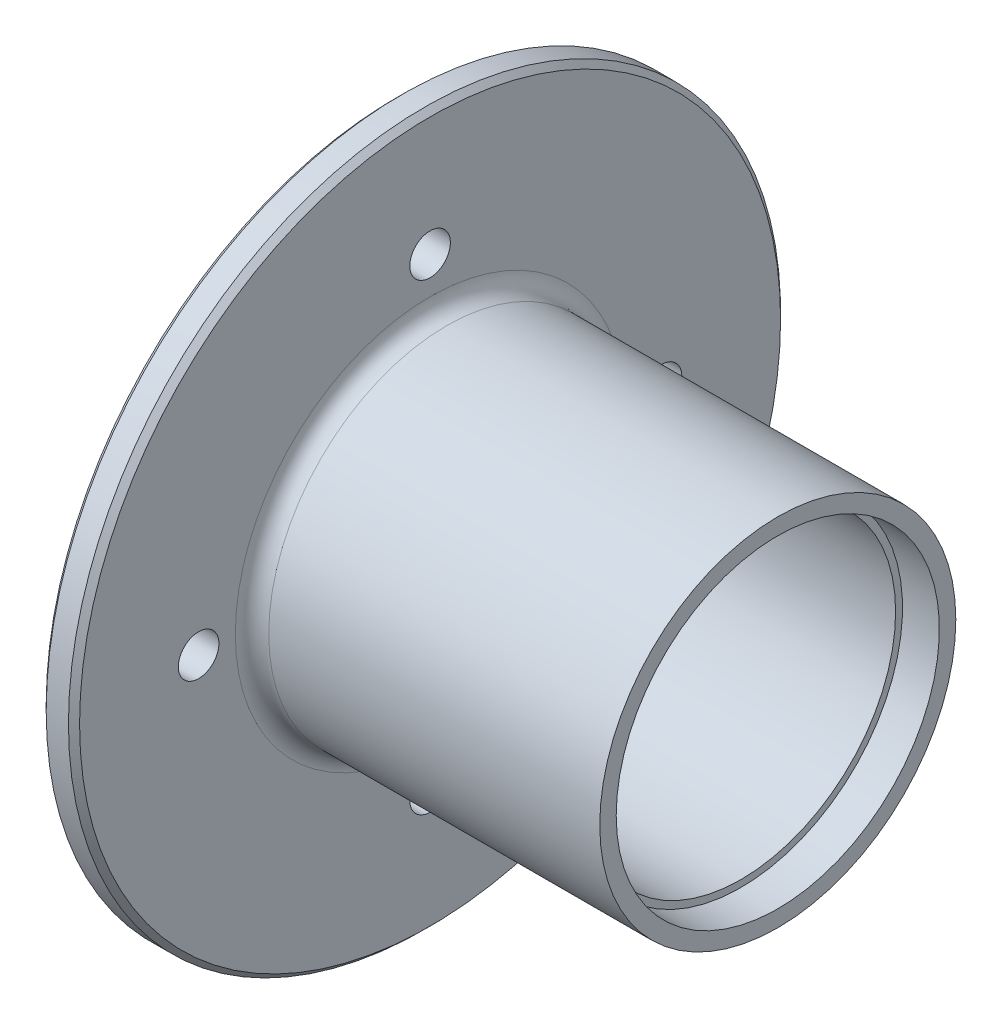
ISO-10303-21;
HEADER;
FILE_DESCRIPTION(('STEP AP214'),'2;1');
FILE_NAME('part.step','',(''),(''),'','','');
FILE_SCHEMA(('AUTOMOTIVE_DESIGN { 1 0 10303 214 1 1 1 1 }'));
ENDSEC;
DATA;
#1=APPLICATION_CONTEXT('core data for automotive mechanical design processes');
#2=APPLICATION_PROTOCOL_DEFINITION('international standard','automotive_design',2000,#1);
#3=PRODUCT_CONTEXT('',#1,'mechanical');
#4=PRODUCT('Part','Part','',(#3));
#5=PRODUCT_RELATED_PRODUCT_CATEGORY('part','',(#4));
#6=PRODUCT_DEFINITION_FORMATION('','',#4);
#7=PRODUCT_DEFINITION_CONTEXT('part definition',#1,'design');
#8=PRODUCT_DEFINITION('design','',#6,#7);
#9=PRODUCT_DEFINITION_SHAPE('','',#8);
#10=(LENGTH_UNIT() NAMED_UNIT(*) SI_UNIT(.MILLI.,.METRE.));
#11=(NAMED_UNIT(*) PLANE_ANGLE_UNIT() SI_UNIT($,.RADIAN.));
#12=(NAMED_UNIT(*) SI_UNIT($,.STERADIAN.) SOLID_ANGLE_UNIT());
#13=UNCERTAINTY_MEASURE_WITH_UNIT(LENGTH_MEASURE(1.E-05),#10,'distance_accuracy_value','');
#14=(GEOMETRIC_REPRESENTATION_CONTEXT(3) GLOBAL_UNCERTAINTY_ASSIGNED_CONTEXT((#13)) GLOBAL_UNIT_ASSIGNED_CONTEXT((#10,
#11,#12)) REPRESENTATION_CONTEXT('',''));
#15=CARTESIAN_POINT('',(0.,0.,0.));
#16=DIRECTION('',(0.,0.,1.));
#17=DIRECTION('',(1.,0.,0.));
#18=AXIS2_PLACEMENT_3D('',#15,#16,#17);
#19=CARTESIAN_POINT('',(10.4893383997967,0.,0.));
#20=DIRECTION('',(-1.,0.,0.));
#21=DIRECTION('',(0.,0.,1.));
#22=AXIS2_PLACEMENT_3D('',#19,#20,#21);
#23=TOROIDAL_SURFACE('',#22,27.78125,2.38125);
#24=CARTESIAN_POINT('',(10.4893383997967,0.,0.));
#25=DIRECTION('',(-1.,0.,0.));
#26=DIRECTION('',(0.,0.,1.));
#27=AXIS2_PLACEMENT_3D('',#24,#25,#26);
#28=CIRCLE('',#27,25.4);
#29=CARTESIAN_POINT('',(10.4893383997967,0.,25.4));
#30=VERTEX_POINT('',#29);
#31=EDGE_CURVE('E104',#30,#30,#28,.T.);
#32=ORIENTED_EDGE('',*,*,#31,.T.);
#33=EDGE_LOOP('',(#32));
#34=FACE_BOUND('',#33,.T.);
#35=CARTESIAN_POINT('',(8.10808839979671,0.,0.));
#36=DIRECTION('',(-1.,0.,0.));
#37=DIRECTION('',(0.,0.,1.));
#38=AXIS2_PLACEMENT_3D('',#35,#36,#37);
#39=CIRCLE('',#38,27.78125);
#40=CARTESIAN_POINT('',(8.10808839979671,0.,27.78125));
#41=VERTEX_POINT('',#40);
#42=EDGE_CURVE('E10',#41,#41,#39,.T.);
#43=ORIENTED_EDGE('',*,*,#42,.F.);
#44=EDGE_LOOP('',(#43));
#45=FACE_BOUND('',#44,.T.);
#46=ADVANCED_FACE('F41',(#34,#45),#23,.F.);
#47=CARTESIAN_POINT('',(8.10808839979671,0.,0.));
#48=DIRECTION('',(-1.,0.,0.));
#49=DIRECTION('',(0.,0.,1.));
#50=AXIS2_PLACEMENT_3D('',#47,#48,#49);
#51=PLANE('',#50);
#52=CARTESIAN_POINT('',(8.10808839979671,3.45866141425801E-13,33.02));
#53=DIRECTION('',(1.,0.,0.));
#54=DIRECTION('',(0.,0.,-1.));
#55=AXIS2_PLACEMENT_3D('',#52,#53,#54);
#56=CIRCLE('',#55,2.8956);
#57=CARTESIAN_POINT('',(8.10808839979671,3.45866141425801E-13,30.1244));
#58=VERTEX_POINT('',#57);
#59=EDGE_CURVE('E136',#58,#58,#56,.T.);
#60=ORIENTED_EDGE('',*,*,#59,.F.);
#61=EDGE_LOOP('',(#60));
#62=FACE_BOUND('',#61,.T.);
#63=CARTESIAN_POINT('',(8.10808839979671,-33.02,0.));
#64=DIRECTION('',(1.,0.,0.));
#65=DIRECTION('',(0.,0.,-1.));
#66=AXIS2_PLACEMENT_3D('',#63,#64,#65);
#67=CIRCLE('',#66,2.8956);
#68=CARTESIAN_POINT('',(8.10808839979671,-33.02,-2.8956));
#69=VERTEX_POINT('',#68);
#70=EDGE_CURVE('E128',#69,#69,#67,.T.);
#71=ORIENTED_EDGE('',*,*,#70,.F.);
#72=EDGE_LOOP('',(#71));
#73=FACE_BOUND('',#72,.T.);
#74=CARTESIAN_POINT('',(8.10808839979671,-1.152887138086E-13,-33.02));
#75=DIRECTION('',(1.,0.,0.));
#76=DIRECTION('',(0.,0.,-1.));
#77=AXIS2_PLACEMENT_3D('',#74,#75,#76);
#78=CIRCLE('',#77,2.8956);
#79=CARTESIAN_POINT('',(8.10808839979671,-1.152887138086E-13,-35.9156));
#80=VERTEX_POINT('',#79);
#81=EDGE_CURVE('E120',#80,#80,#78,.T.);
#82=ORIENTED_EDGE('',*,*,#81,.F.);
#83=EDGE_LOOP('',(#82));
#84=FACE_BOUND('',#83,.T.);
#85=CARTESIAN_POINT('',(8.10808839979671,33.02,0.));
#86=DIRECTION('',(1.,0.,0.));
#87=DIRECTION('',(0.,0.,-1.));
#88=AXIS2_PLACEMENT_3D('',#85,#86,#87);
#89=CIRCLE('',#88,2.8956);
#90=CARTESIAN_POINT('',(8.10808839979671,33.02,-2.8956));
#91=VERTEX_POINT('',#90);
#92=EDGE_CURVE('E112',#91,#91,#89,.T.);
#93=ORIENTED_EDGE('',*,*,#92,.F.);
#94=EDGE_LOOP('',(#93));
#95=FACE_BOUND('',#94,.T.);
#96=CARTESIAN_POINT('',(8.10808839979671,0.,0.));
#97=DIRECTION('',(-1.,0.,0.));
#98=DIRECTION('',(0.,0.,1.));
#99=AXIS2_PLACEMENT_3D('',#96,#97,#98);
#100=CIRCLE('',#99,50.00625);
#101=CARTESIAN_POINT('',(8.10808839979671,0.,50.00625));
#102=VERTEX_POINT('',#101);
#103=EDGE_CURVE('E48',#102,#102,#100,.T.);
#104=ORIENTED_EDGE('',*,*,#103,.F.);
#105=EDGE_LOOP('',(#104));
#106=FACE_BOUND('',#105,.T.);
#107=ORIENTED_EDGE('',*,*,#42,.T.);
#108=EDGE_LOOP('',(#107));
#109=FACE_BOUND('',#108,.T.);
#110=ADVANCED_FACE('F143',(#62,#73,#84,#95,#106,#109),#51,.F.);
#111=CARTESIAN_POINT('',(8.10808839979671,0.,0.));
#112=DIRECTION('',(-1.,0.,0.));
#113=DIRECTION('',(0.,0.,1.));
#114=AXIS2_PLACEMENT_3D('',#111,#112,#113);
#115=CONICAL_SURFACE('',#114,50.00625,0.785398163397448);
#116=CARTESIAN_POINT('',(7.3143383997967,0.,0.));
#117=DIRECTION('',(-1.,0.,0.));
#118=DIRECTION('',(0.,0.,1.));
#119=AXIS2_PLACEMENT_3D('',#116,#117,#118);
#120=CIRCLE('',#119,50.8);
#121=CARTESIAN_POINT('',(7.3143383997967,0.,50.8));
#122=VERTEX_POINT('',#121);
#123=EDGE_CURVE('E53',#122,#122,#120,.T.);
#124=ORIENTED_EDGE('',*,*,#123,.F.);
#125=EDGE_LOOP('',(#124));
#126=FACE_BOUND('',#125,.T.);
#127=ORIENTED_EDGE('',*,*,#103,.T.);
#128=EDGE_LOOP('',(#127));
#129=FACE_BOUND('',#128,.T.);
#130=ADVANCED_FACE('F146',(#126,#129),#115,.T.);
#131=CARTESIAN_POINT('',(0.,0.,0.));
#132=DIRECTION('',(-1.,0.,0.));
#133=DIRECTION('',(0.,0.,1.));
#134=AXIS2_PLACEMENT_3D('',#131,#132,#133);
#135=CYLINDRICAL_SURFACE('',#134,50.8);
#136=CARTESIAN_POINT('',(4.13933839979672,0.,0.));
#137=DIRECTION('',(-1.,0.,0.));
#138=DIRECTION('',(0.,0.,1.));
#139=AXIS2_PLACEMENT_3D('',#136,#137,#138);
#140=CIRCLE('',#139,50.8);
#141=CARTESIAN_POINT('',(4.13933839979672,0.,50.8));
#142=VERTEX_POINT('',#141);
#143=EDGE_CURVE('E58',#142,#142,#140,.T.);
#144=ORIENTED_EDGE('',*,*,#143,.F.);
#145=EDGE_LOOP('',(#144));
#146=FACE_BOUND('',#145,.T.);
#147=ORIENTED_EDGE('',*,*,#123,.T.);
#148=EDGE_LOOP('',(#147));
#149=FACE_BOUND('',#148,.T.);
#150=ADVANCED_FACE('F237',(#146,#149),#135,.T.);
#151=CARTESIAN_POINT('',(4.13933839979672,0.,0.));
#152=DIRECTION('',(1.,0.,0.));
#153=DIRECTION('',(0.,0.,-1.));
#154=AXIS2_PLACEMENT_3D('',#151,#152,#153);
#155=CONICAL_SURFACE('',#154,50.8,0.785398163397448);
#156=CARTESIAN_POINT('',(3.34558839979671,0.,0.));
#157=DIRECTION('',(-1.,0.,0.));
#158=DIRECTION('',(0.,0.,1.));
#159=AXIS2_PLACEMENT_3D('',#156,#157,#158);
#160=CIRCLE('',#159,50.0062499999999);
#161=CARTESIAN_POINT('',(3.34558839979671,0.,50.0062499999999));
#162=VERTEX_POINT('',#161);
#163=EDGE_CURVE('E64',#162,#162,#160,.T.);
#164=ORIENTED_EDGE('',*,*,#163,.F.);
#165=EDGE_LOOP('',(#164));
#166=FACE_BOUND('',#165,.T.);
#167=ORIENTED_EDGE('',*,*,#143,.T.);
#168=EDGE_LOOP('',(#167));
#169=FACE_BOUND('',#168,.T.);
#170=ADVANCED_FACE('F230',(#166,#169),#155,.T.);
#171=CARTESIAN_POINT('',(3.34558839979671,0.,0.));
#172=DIRECTION('',(1.,0.,0.));
#173=DIRECTION('',(0.,0.,-1.));
#174=AXIS2_PLACEMENT_3D('',#171,#172,#173);
#175=PLANE('',#174);
#176=CARTESIAN_POINT('',(3.34558839979671,3.45866141425801E-13,33.02));
#177=DIRECTION('',(1.,0.,0.));
#178=DIRECTION('',(0.,0.,-1.));
#179=AXIS2_PLACEMENT_3D('',#176,#177,#178);
#180=CIRCLE('',#179,2.8956);
#181=CARTESIAN_POINT('',(3.34558839979671,3.45866141425801E-13,30.1244));
#182=VERTEX_POINT('',#181);
#183=EDGE_CURVE('E132',#182,#182,#180,.T.);
#184=ORIENTED_EDGE('',*,*,#183,.T.);
#185=EDGE_LOOP('',(#184));
#186=FACE_BOUND('',#185,.T.);
#187=CARTESIAN_POINT('',(3.34558839979671,-33.02,0.));
#188=DIRECTION('',(1.,0.,0.));
#189=DIRECTION('',(0.,0.,-1.));
#190=AXIS2_PLACEMENT_3D('',#187,#188,#189);
#191=CIRCLE('',#190,2.8956);
#192=CARTESIAN_POINT('',(3.34558839979671,-33.02,-2.8956));
#193=VERTEX_POINT('',#192);
#194=EDGE_CURVE('E124',#193,#193,#191,.T.);
#195=ORIENTED_EDGE('',*,*,#194,.T.);
#196=EDGE_LOOP('',(#195));
#197=FACE_BOUND('',#196,.T.);
#198=CARTESIAN_POINT('',(3.34558839979671,-1.152887138086E-13,-33.02));
#199=DIRECTION('',(1.,0.,0.));
#200=DIRECTION('',(0.,0.,-1.));
#201=AXIS2_PLACEMENT_3D('',#198,#199,#200);
#202=CIRCLE('',#201,2.8956);
#203=CARTESIAN_POINT('',(3.34558839979671,-1.152887138086E-13,-35.9156));
#204=VERTEX_POINT('',#203);
#205=EDGE_CURVE('E116',#204,#204,#202,.T.);
#206=ORIENTED_EDGE('',*,*,#205,.T.);
#207=EDGE_LOOP('',(#206));
#208=FACE_BOUND('',#207,.T.);
#209=CARTESIAN_POINT('',(3.34558839979671,33.02,0.));
#210=DIRECTION('',(1.,0.,0.));
#211=DIRECTION('',(0.,0.,-1.));
#212=AXIS2_PLACEMENT_3D('',#209,#210,#211);
#213=CIRCLE('',#212,2.8956);
#214=CARTESIAN_POINT('',(3.34558839979671,33.02,-2.8956));
#215=VERTEX_POINT('',#214);
#216=EDGE_CURVE('E108',#215,#215,#213,.T.);
#217=ORIENTED_EDGE('',*,*,#216,.T.);
#218=EDGE_LOOP('',(#217));
#219=FACE_BOUND('',#218,.T.);
#220=CARTESIAN_POINT('',(3.34558839979671,0.,0.));
#221=DIRECTION('',(-1.,0.,0.));
#222=DIRECTION('',(0.,0.,1.));
#223=AXIS2_PLACEMENT_3D('',#220,#221,#222);
#224=CIRCLE('',#223,17.143351135521);
#225=CARTESIAN_POINT('',(3.34558839979671,0.,17.143351135521));
#226=VERTEX_POINT('',#225);
#227=EDGE_CURVE('E68',#226,#226,#224,.T.);
#228=ORIENTED_EDGE('',*,*,#227,.F.);
#229=EDGE_LOOP('',(#228));
#230=FACE_BOUND('',#229,.T.);
#231=ORIENTED_EDGE('',*,*,#163,.T.);
#232=EDGE_LOOP('',(#231));
#233=FACE_BOUND('',#232,.T.);
#234=ADVANCED_FACE('F224',(#186,#197,#208,#219,#230,#233),#175,.F.);
#235=CARTESIAN_POINT('',(3.34558839979671,0.,0.));
#236=DIRECTION('',(-1.,0.,0.));
#237=DIRECTION('',(0.,0.,1.));
#238=AXIS2_PLACEMENT_3D('',#235,#236,#237);
#239=CONICAL_SURFACE('',#238,17.143351135521,0.767642261232655);
#240=CARTESIAN_POINT('',(8.10808839979671,0.,0.));
#241=DIRECTION('',(-1.,0.,0.));
#242=DIRECTION('',(0.,0.,1.));
#243=AXIS2_PLACEMENT_3D('',#240,#241,#242);
#244=CIRCLE('',#243,12.5470426882416);
#245=CARTESIAN_POINT('',(8.10808839979671,0.,12.5470426882416));
#246=VERTEX_POINT('',#245);
#247=EDGE_CURVE('E72',#246,#246,#244,.T.);
#248=ORIENTED_EDGE('',*,*,#247,.F.);
#249=EDGE_LOOP('',(#248));
#250=FACE_BOUND('',#249,.T.);
#251=ORIENTED_EDGE('',*,*,#227,.T.);
#252=EDGE_LOOP('',(#251));
#253=FACE_BOUND('',#252,.T.);
#254=ADVANCED_FACE('F218',(#250,#253),#239,.F.);
#255=CARTESIAN_POINT('',(8.10808839979671,0.,0.));
#256=DIRECTION('',(-1.,0.,0.));
#257=DIRECTION('',(0.,0.,1.));
#258=AXIS2_PLACEMENT_3D('',#255,#256,#257);
#259=PLANE('',#258);
#260=CARTESIAN_POINT('',(8.10808839979671,0.,0.));
#261=DIRECTION('',(-1.,0.,0.));
#262=DIRECTION('',(0.,0.,1.));
#263=AXIS2_PLACEMENT_3D('',#260,#261,#262);
#264=CIRCLE('',#263,17.143351135521);
#265=CARTESIAN_POINT('',(8.10808839979671,0.,17.143351135521));
#266=VERTEX_POINT('',#265);
#267=EDGE_CURVE('E76',#266,#266,#264,.T.);
#268=ORIENTED_EDGE('',*,*,#267,.F.);
#269=EDGE_LOOP('',(#268));
#270=FACE_BOUND('',#269,.T.);
#271=ORIENTED_EDGE('',*,*,#247,.T.);
#272=EDGE_LOOP('',(#271));
#273=FACE_BOUND('',#272,.T.);
#274=ADVANCED_FACE('F212',(#270,#273),#259,.F.);
#275=CARTESIAN_POINT('',(0.,0.,0.));
#276=DIRECTION('',(-1.,0.,0.));
#277=DIRECTION('',(0.,0.,1.));
#278=AXIS2_PLACEMENT_3D('',#275,#276,#277);
#279=CYLINDRICAL_SURFACE('',#278,17.143351135521);
#280=CARTESIAN_POINT('',(23.5484240499049,0.,0.));
#281=DIRECTION('',(-1.,0.,0.));
#282=DIRECTION('',(0.,0.,1.));
#283=AXIS2_PLACEMENT_3D('',#280,#281,#282);
#284=CIRCLE('',#283,17.143351135521);
#285=CARTESIAN_POINT('',(23.5484240499049,0.,17.143351135521));
#286=VERTEX_POINT('',#285);
#287=EDGE_CURVE('E80',#286,#286,#284,.T.);
#288=ORIENTED_EDGE('',*,*,#287,.F.);
#289=EDGE_LOOP('',(#288));
#290=FACE_BOUND('',#289,.T.);
#291=ORIENTED_EDGE('',*,*,#267,.T.);
#292=EDGE_LOOP('',(#291));
#293=FACE_BOUND('',#292,.T.);
#294=ADVANCED_FACE('F206',(#290,#293),#279,.F.);
#295=CARTESIAN_POINT('',(23.5484240499049,0.,0.));
#296=DIRECTION('',(-1.,0.,0.));
#297=DIRECTION('',(0.,0.,1.));
#298=AXIS2_PLACEMENT_3D('',#295,#296,#297);
#299=PLANE('',#298);
#300=CARTESIAN_POINT('',(23.5484240499049,0.,0.));
#301=DIRECTION('',(-1.,0.,0.));
#302=DIRECTION('',(0.,0.,1.));
#303=AXIS2_PLACEMENT_3D('',#300,#301,#302);
#304=CIRCLE('',#303,22.067968077904);
#305=CARTESIAN_POINT('',(23.5484240499049,0.,22.067968077904));
#306=VERTEX_POINT('',#305);
#307=EDGE_CURVE('E84',#306,#306,#304,.T.);
#308=ORIENTED_EDGE('',*,*,#307,.F.);
#309=EDGE_LOOP('',(#308));
#310=FACE_BOUND('',#309,.T.);
#311=ORIENTED_EDGE('',*,*,#287,.T.);
#312=EDGE_LOOP('',(#311));
#313=FACE_BOUND('',#312,.T.);
#314=ADVANCED_FACE('F200',(#310,#313),#299,.F.);
#315=CARTESIAN_POINT('',(0.,0.,0.));
#316=DIRECTION('',(-1.,0.,0.));
#317=DIRECTION('',(0.,0.,1.));
#318=AXIS2_PLACEMENT_3D('',#315,#316,#317);
#319=CYLINDRICAL_SURFACE('',#318,22.067968077904);
#320=CARTESIAN_POINT('',(52.4579882922135,0.,0.));
#321=DIRECTION('',(-1.,0.,0.));
#322=DIRECTION('',(0.,0.,1.));
#323=AXIS2_PLACEMENT_3D('',#320,#321,#322);
#324=CIRCLE('',#323,22.067968077904);
#325=CARTESIAN_POINT('',(52.4579882922135,0.,22.067968077904));
#326=VERTEX_POINT('',#325);
#327=EDGE_CURVE('E88',#326,#326,#324,.T.);
#328=ORIENTED_EDGE('',*,*,#327,.F.);
#329=EDGE_LOOP('',(#328));
#330=FACE_BOUND('',#329,.T.);
#331=ORIENTED_EDGE('',*,*,#307,.T.);
#332=EDGE_LOOP('',(#331));
#333=FACE_BOUND('',#332,.T.);
#334=ADVANCED_FACE('F194',(#330,#333),#319,.F.);
#335=CARTESIAN_POINT('',(52.4579882922135,0.,0.));
#336=DIRECTION('',(-1.,0.,0.));
#337=DIRECTION('',(0.,0.,1.));
#338=AXIS2_PLACEMENT_3D('',#335,#336,#337);
#339=PLANE('',#338);
#340=CARTESIAN_POINT('',(52.4579882922135,0.,0.));
#341=DIRECTION('',(-1.,0.,0.));
#342=DIRECTION('',(0.,0.,1.));
#343=AXIS2_PLACEMENT_3D('',#340,#341,#342);
#344=CIRCLE('',#343,23.0528912698023);
#345=CARTESIAN_POINT('',(52.4579882922135,0.,23.0528912698023));
#346=VERTEX_POINT('',#345);
#347=EDGE_CURVE('E92',#346,#346,#344,.T.);
#348=ORIENTED_EDGE('',*,*,#347,.F.);
#349=EDGE_LOOP('',(#348));
#350=FACE_BOUND('',#349,.T.);
#351=ORIENTED_EDGE('',*,*,#327,.T.);
#352=EDGE_LOOP('',(#351));
#353=FACE_BOUND('',#352,.T.);
#354=ADVANCED_FACE('F188',(#350,#353),#339,.F.);
#355=CARTESIAN_POINT('',(0.,0.,0.));
#356=DIRECTION('',(-1.,0.,0.));
#357=DIRECTION('',(0.,0.,1.));
#358=AXIS2_PLACEMENT_3D('',#355,#356,#357);
#359=CYLINDRICAL_SURFACE('',#358,23.0528912698023);
#360=CARTESIAN_POINT('',(57.7142730811039,0.,0.));
#361=DIRECTION('',(-1.,0.,0.));
#362=DIRECTION('',(0.,0.,1.));
#363=AXIS2_PLACEMENT_3D('',#360,#361,#362);
#364=CIRCLE('',#363,23.0528912698023);
#365=CARTESIAN_POINT('',(57.7142730811039,0.,23.0528912698023));
#366=VERTEX_POINT('',#365);
#367=EDGE_CURVE('E96',#366,#366,#364,.T.);
#368=ORIENTED_EDGE('',*,*,#367,.F.);
#369=EDGE_LOOP('',(#368));
#370=FACE_BOUND('',#369,.T.);
#371=ORIENTED_EDGE('',*,*,#347,.T.);
#372=EDGE_LOOP('',(#371));
#373=FACE_BOUND('',#372,.T.);
#374=ADVANCED_FACE('F182',(#370,#373),#359,.F.);
#375=CARTESIAN_POINT('',(57.7142730811039,0.,0.));
#376=DIRECTION('',(-1.,0.,0.));
#377=DIRECTION('',(0.,0.,1.));
#378=AXIS2_PLACEMENT_3D('',#375,#376,#377);
#379=PLANE('',#378);
#380=CARTESIAN_POINT('',(57.7142730811039,0.,0.));
#381=DIRECTION('',(-1.,0.,0.));
#382=DIRECTION('',(0.,0.,1.));
#383=AXIS2_PLACEMENT_3D('',#380,#381,#382);
#384=CIRCLE('',#383,25.4);
#385=CARTESIAN_POINT('',(57.7142730811039,0.,25.4));
#386=VERTEX_POINT('',#385);
#387=EDGE_CURVE('E100',#386,#386,#384,.T.);
#388=ORIENTED_EDGE('',*,*,#387,.F.);
#389=EDGE_LOOP('',(#388));
#390=FACE_BOUND('',#389,.T.);
#391=ORIENTED_EDGE('',*,*,#367,.T.);
#392=EDGE_LOOP('',(#391));
#393=FACE_BOUND('',#392,.T.);
#394=ADVANCED_FACE('F167',(#390,#393),#379,.F.);
#395=CARTESIAN_POINT('',(0.,0.,0.));
#396=DIRECTION('',(-1.,0.,0.));
#397=DIRECTION('',(0.,0.,1.));
#398=AXIS2_PLACEMENT_3D('',#395,#396,#397);
#399=CYLINDRICAL_SURFACE('',#398,25.4);
#400=ORIENTED_EDGE('',*,*,#31,.F.);
#401=EDGE_LOOP('',(#400));
#402=FACE_BOUND('',#401,.T.);
#403=ORIENTED_EDGE('',*,*,#387,.T.);
#404=EDGE_LOOP('',(#403));
#405=FACE_BOUND('',#404,.T.);
#406=ADVANCED_FACE('F157',(#402,#405),#399,.T.);
#407=CARTESIAN_POINT('',(8.10808839979671,33.02,0.));
#408=DIRECTION('',(1.,0.,0.));
#409=DIRECTION('',(0.,0.,-1.));
#410=AXIS2_PLACEMENT_3D('',#407,#408,#409);
#411=CYLINDRICAL_SURFACE('',#410,2.8956);
#412=ORIENTED_EDGE('',*,*,#216,.F.);
#413=EDGE_LOOP('',(#412));
#414=FACE_BOUND('',#413,.T.);
#415=ORIENTED_EDGE('',*,*,#92,.T.);
#416=EDGE_LOOP('',(#415));
#417=FACE_BOUND('',#416,.T.);
#418=ADVANCED_FACE('F154',(#414,#417),#411,.F.);
#419=CARTESIAN_POINT('',(8.10808839979671,-1.152887138086E-13,-33.02));
#420=DIRECTION('',(1.,0.,0.));
#421=DIRECTION('',(0.,0.,-1.));
#422=AXIS2_PLACEMENT_3D('',#419,#420,#421);
#423=CYLINDRICAL_SURFACE('',#422,2.8956);
#424=ORIENTED_EDGE('',*,*,#205,.F.);
#425=EDGE_LOOP('',(#424));
#426=FACE_BOUND('',#425,.T.);
#427=ORIENTED_EDGE('',*,*,#81,.T.);
#428=EDGE_LOOP('',(#427));
#429=FACE_BOUND('',#428,.T.);
#430=ADVANCED_FACE('F156',(#426,#429),#423,.F.);
#431=CARTESIAN_POINT('',(8.10808839979671,-33.02,0.));
#432=DIRECTION('',(1.,0.,0.));
#433=DIRECTION('',(0.,0.,-1.));
#434=AXIS2_PLACEMENT_3D('',#431,#432,#433);
#435=CYLINDRICAL_SURFACE('',#434,2.8956);
#436=ORIENTED_EDGE('',*,*,#194,.F.);
#437=EDGE_LOOP('',(#436));
#438=FACE_BOUND('',#437,.T.);
#439=ORIENTED_EDGE('',*,*,#70,.T.);
#440=EDGE_LOOP('',(#439));
#441=FACE_BOUND('',#440,.T.);
#442=ADVANCED_FACE('F164',(#438,#441),#435,.F.);
#443=CARTESIAN_POINT('',(8.10808839979671,3.45866141425801E-13,33.02));
#444=DIRECTION('',(1.,0.,0.));
#445=DIRECTION('',(0.,0.,-1.));
#446=AXIS2_PLACEMENT_3D('',#443,#444,#445);
#447=CYLINDRICAL_SURFACE('',#446,2.8956);
#448=ORIENTED_EDGE('',*,*,#183,.F.);
#449=EDGE_LOOP('',(#448));
#450=FACE_BOUND('',#449,.T.);
#451=ORIENTED_EDGE('',*,*,#59,.T.);
#452=EDGE_LOOP('',(#451));
#453=FACE_BOUND('',#452,.T.);
#454=ADVANCED_FACE('F141',(#450,#453),#447,.F.);
#455=CLOSED_SHELL('',(#46,#110,#130,#150,#170,#234,#254,#274,#294,#314,#334,#354,#374,#394,#406,
#418,#430,#442,#454));
#456=MANIFOLD_SOLID_BREP('B2',#455);
#457=ADVANCED_BREP_SHAPE_REPRESENTATION('',(#18,#456),#14);
#458=SHAPE_DEFINITION_REPRESENTATION(#9,#457);
ENDSEC;
END-ISO-10303-21;
